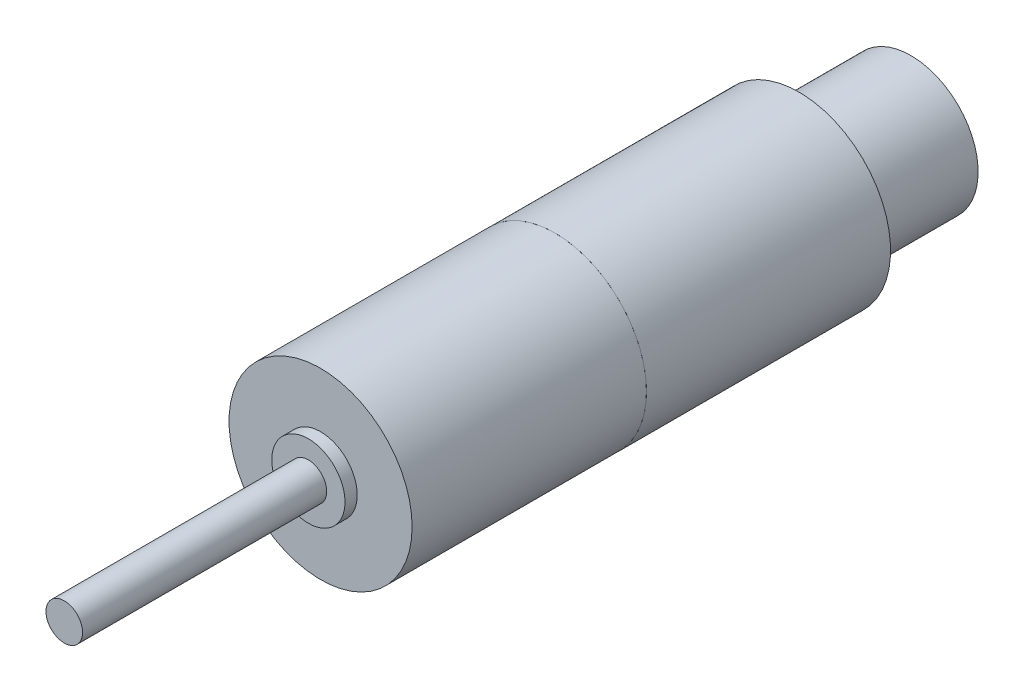
ISO-10303-21;
HEADER;
FILE_DESCRIPTION(('STEP AP214'),'2;1');
FILE_NAME('part.step','',(''),(''),'','','');
FILE_SCHEMA(('AUTOMOTIVE_DESIGN { 1 0 10303 214 1 1 1 1 }'));
ENDSEC;
DATA;
#1=APPLICATION_CONTEXT('core data for automotive mechanical design processes');
#2=APPLICATION_PROTOCOL_DEFINITION('international standard','automotive_design',2000,#1);
#3=PRODUCT_CONTEXT('',#1,'mechanical');
#4=PRODUCT('Part','Part','',(#3));
#5=PRODUCT_RELATED_PRODUCT_CATEGORY('part','',(#4));
#6=PRODUCT_DEFINITION_FORMATION('','',#4);
#7=PRODUCT_DEFINITION_CONTEXT('part definition',#1,'design');
#8=PRODUCT_DEFINITION('design','',#6,#7);
#9=PRODUCT_DEFINITION_SHAPE('','',#8);
#10=(LENGTH_UNIT() NAMED_UNIT(*) SI_UNIT(.MILLI.,.METRE.));
#11=(NAMED_UNIT(*) PLANE_ANGLE_UNIT() SI_UNIT($,.RADIAN.));
#12=(NAMED_UNIT(*) SI_UNIT($,.STERADIAN.) SOLID_ANGLE_UNIT());
#13=UNCERTAINTY_MEASURE_WITH_UNIT(LENGTH_MEASURE(1.E-05),#10,'distance_accuracy_value','');
#14=(GEOMETRIC_REPRESENTATION_CONTEXT(3) GLOBAL_UNCERTAINTY_ASSIGNED_CONTEXT((#13)) GLOBAL_UNIT_ASSIGNED_CONTEXT((#10,
#11,#12)) REPRESENTATION_CONTEXT('',''));
#15=CARTESIAN_POINT('',(0.,0.,0.));
#16=DIRECTION('',(0.,0.,1.));
#17=DIRECTION('',(1.,0.,0.));
#18=AXIS2_PLACEMENT_3D('',#15,#16,#17);
#19=CARTESIAN_POINT('',(0.,0.,80.4));
#20=DIRECTION('',(0.,0.,-1.));
#21=DIRECTION('',(-1.,0.,0.));
#22=AXIS2_PLACEMENT_3D('',#19,#20,#21);
#23=CYLINDRICAL_SURFACE('',#22,3.);
#24=CARTESIAN_POINT('',(0.,0.,80.4));
#25=DIRECTION('',(0.,0.,1.));
#26=DIRECTION('',(1.,0.,0.));
#27=AXIS2_PLACEMENT_3D('',#24,#25,#26);
#28=CIRCLE('',#27,3.);
#29=CARTESIAN_POINT('',(3.,0.,80.4));
#30=VERTEX_POINT('',#29);
#31=EDGE_CURVE('E11',#30,#30,#28,.T.);
#32=ORIENTED_EDGE('',*,*,#31,.F.);
#33=EDGE_LOOP('',(#32));
#34=FACE_BOUND('',#33,.T.);
#35=CARTESIAN_POINT('',(0.,0.,40.4));
#36=DIRECTION('',(0.,0.,1.));
#37=DIRECTION('',(1.,0.,0.));
#38=AXIS2_PLACEMENT_3D('',#35,#36,#37);
#39=CIRCLE('',#38,3.);
#40=CARTESIAN_POINT('',(3.,0.,40.4));
#41=VERTEX_POINT('',#40);
#42=EDGE_CURVE('E46',#41,#41,#39,.T.);
#43=ORIENTED_EDGE('',*,*,#42,.T.);
#44=EDGE_LOOP('',(#43));
#45=FACE_BOUND('',#44,.T.);
#46=ADVANCED_FACE('F43',(#34,#45),#23,.T.);
#47=CARTESIAN_POINT('',(0.,0.,80.4));
#48=DIRECTION('',(0.,0.,1.));
#49=DIRECTION('',(1.,0.,0.));
#50=AXIS2_PLACEMENT_3D('',#47,#48,#49);
#51=PLANE('',#50);
#52=ORIENTED_EDGE('',*,*,#31,.T.);
#53=EDGE_LOOP('',(#52));
#54=FACE_BOUND('',#53,.T.);
#55=ADVANCED_FACE('F58',(#54),#51,.T.);
#56=CARTESIAN_POINT('',(0.,0.,40.4));
#57=DIRECTION('',(0.,0.,1.));
#58=DIRECTION('',(1.,0.,0.));
#59=AXIS2_PLACEMENT_3D('',#56,#57,#58);
#60=PLANE('',#59);
#61=ORIENTED_EDGE('',*,*,#42,.F.);
#62=EDGE_LOOP('',(#61));
#63=FACE_BOUND('',#62,.T.);
#64=ADVANCED_FACE('F56',(#63),#60,.F.);
#65=CLOSED_SHELL('',(#46,#55,#64));
#66=MANIFOLD_SOLID_BREP('B2',#65);
#67=CARTESIAN_POINT('',(0.,0.,-58.35));
#68=DIRECTION('',(0.,0.,1.));
#69=DIRECTION('',(1.,0.,0.));
#70=AXIS2_PLACEMENT_3D('',#67,#68,#69);
#71=CYLINDRICAL_SURFACE('',#70,11.);
#72=CARTESIAN_POINT('',(0.,0.,-58.35));
#73=DIRECTION('',(0.,0.,-1.));
#74=DIRECTION('',(-1.,0.,0.));
#75=AXIS2_PLACEMENT_3D('',#72,#73,#74);
#76=CIRCLE('',#75,11.);
#77=CARTESIAN_POINT('',(-11.,0.,-58.35));
#78=VERTEX_POINT('',#77);
#79=EDGE_CURVE('E42',#78,#78,#76,.T.);
#80=ORIENTED_EDGE('',*,*,#79,.F.);
#81=EDGE_LOOP('',(#80));
#82=FACE_BOUND('',#81,.T.);
#83=CARTESIAN_POINT('',(0.,0.,-40.));
#84=DIRECTION('',(0.,0.,-1.));
#85=DIRECTION('',(-1.,0.,0.));
#86=AXIS2_PLACEMENT_3D('',#83,#84,#85);
#87=CIRCLE('',#86,11.);
#88=CARTESIAN_POINT('',(-11.,0.,-40.));
#89=VERTEX_POINT('',#88);
#90=EDGE_CURVE('E94',#89,#89,#87,.T.);
#91=ORIENTED_EDGE('',*,*,#90,.T.);
#92=EDGE_LOOP('',(#91));
#93=FACE_BOUND('',#92,.T.);
#94=ADVANCED_FACE('F91',(#82,#93),#71,.T.);
#95=CARTESIAN_POINT('',(0.,0.,-58.35));
#96=DIRECTION('',(0.,0.,-1.));
#97=DIRECTION('',(-1.,0.,0.));
#98=AXIS2_PLACEMENT_3D('',#95,#96,#97);
#99=PLANE('',#98);
#100=ORIENTED_EDGE('',*,*,#79,.T.);
#101=EDGE_LOOP('',(#100));
#102=FACE_BOUND('',#101,.T.);
#103=ADVANCED_FACE('F106',(#102),#99,.T.);
#104=CARTESIAN_POINT('',(0.,0.,-40.));
#105=DIRECTION('',(0.,0.,-1.));
#106=DIRECTION('',(-1.,0.,0.));
#107=AXIS2_PLACEMENT_3D('',#104,#105,#106);
#108=PLANE('',#107);
#109=ORIENTED_EDGE('',*,*,#90,.F.);
#110=EDGE_LOOP('',(#109));
#111=FACE_BOUND('',#110,.T.);
#112=ADVANCED_FACE('F104',(#111),#108,.F.);
#113=CLOSED_SHELL('',(#94,#103,#112));
#114=MANIFOLD_SOLID_BREP('B6',#113);
#115=CARTESIAN_POINT('',(0.,0.,-40.));
#116=DIRECTION('',(0.,0.,1.));
#117=DIRECTION('',(1.,0.,0.));
#118=AXIS2_PLACEMENT_3D('',#115,#116,#117);
#119=CYLINDRICAL_SURFACE('',#118,15.);
#120=CARTESIAN_POINT('',(0.,0.,-40.));
#121=DIRECTION('',(0.,0.,-1.));
#122=DIRECTION('',(-1.,0.,0.));
#123=AXIS2_PLACEMENT_3D('',#120,#121,#122);
#124=CIRCLE('',#123,15.);
#125=CARTESIAN_POINT('',(-15.,0.,-40.));
#126=VERTEX_POINT('',#125);
#127=EDGE_CURVE('E90',#126,#126,#124,.T.);
#128=ORIENTED_EDGE('',*,*,#127,.F.);
#129=EDGE_LOOP('',(#128));
#130=FACE_BOUND('',#129,.T.);
#131=CARTESIAN_POINT('',(0.,0.,0.));
#132=DIRECTION('',(0.,0.,-1.));
#133=DIRECTION('',(-1.,0.,0.));
#134=AXIS2_PLACEMENT_3D('',#131,#132,#133);
#135=CIRCLE('',#134,15.);
#136=CARTESIAN_POINT('',(-15.,0.,0.));
#137=VERTEX_POINT('',#136);
#138=EDGE_CURVE('E141',#137,#137,#135,.T.);
#139=ORIENTED_EDGE('',*,*,#138,.T.);
#140=EDGE_LOOP('',(#139));
#141=FACE_BOUND('',#140,.T.);
#142=ADVANCED_FACE('F138',(#130,#141),#119,.T.);
#143=CARTESIAN_POINT('',(0.,0.,-40.));
#144=DIRECTION('',(0.,0.,-1.));
#145=DIRECTION('',(-1.,0.,0.));
#146=AXIS2_PLACEMENT_3D('',#143,#144,#145);
#147=PLANE('',#146);
#148=ORIENTED_EDGE('',*,*,#127,.T.);
#149=EDGE_LOOP('',(#148));
#150=FACE_BOUND('',#149,.T.);
#151=ADVANCED_FACE('F153',(#150),#147,.T.);
#152=CARTESIAN_POINT('',(0.,0.,0.));
#153=DIRECTION('',(0.,0.,-1.));
#154=DIRECTION('',(-1.,0.,0.));
#155=AXIS2_PLACEMENT_3D('',#152,#153,#154);
#156=PLANE('',#155);
#157=ORIENTED_EDGE('',*,*,#138,.F.);
#158=EDGE_LOOP('',(#157));
#159=FACE_BOUND('',#158,.T.);
#160=ADVANCED_FACE('F151',(#159),#156,.F.);
#161=CLOSED_SHELL('',(#142,#151,#160));
#162=MANIFOLD_SOLID_BREP('B37',#161);
#163=CARTESIAN_POINT('',(0.,0.,38.4));
#164=DIRECTION('',(0.,0.,-1.));
#165=DIRECTION('',(-1.,0.,0.));
#166=AXIS2_PLACEMENT_3D('',#163,#164,#165);
#167=CYLINDRICAL_SURFACE('',#166,15.);
#168=CARTESIAN_POINT('',(0.,0.,38.4));
#169=DIRECTION('',(0.,0.,1.));
#170=DIRECTION('',(1.,0.,0.));
#171=AXIS2_PLACEMENT_3D('',#168,#169,#170);
#172=CIRCLE('',#171,15.);
#173=CARTESIAN_POINT('',(15.,0.,38.4));
#174=VERTEX_POINT('',#173);
#175=EDGE_CURVE('E185',#174,#174,#172,.T.);
#176=ORIENTED_EDGE('',*,*,#175,.F.);
#177=EDGE_LOOP('',(#176));
#178=FACE_BOUND('',#177,.T.);
#179=CARTESIAN_POINT('',(0.,0.,0.));
#180=DIRECTION('',(0.,0.,1.));
#181=DIRECTION('',(1.,0.,0.));
#182=AXIS2_PLACEMENT_3D('',#179,#180,#181);
#183=CIRCLE('',#182,15.);
#184=CARTESIAN_POINT('',(15.,0.,0.));
#185=VERTEX_POINT('',#184);
#186=EDGE_CURVE('E181',#185,#185,#183,.T.);
#187=ORIENTED_EDGE('',*,*,#186,.T.);
#188=EDGE_LOOP('',(#187));
#189=FACE_BOUND('',#188,.T.);
#190=ADVANCED_FACE('F178',(#178,#189),#167,.T.);
#191=CARTESIAN_POINT('',(0.,0.,38.4));
#192=DIRECTION('',(0.,0.,1.));
#193=DIRECTION('',(1.,0.,0.));
#194=AXIS2_PLACEMENT_3D('',#191,#192,#193);
#195=PLANE('',#194);
#196=CARTESIAN_POINT('',(0.,0.,38.4));
#197=DIRECTION('',(0.,0.,1.));
#198=DIRECTION('',(1.,0.,0.));
#199=AXIS2_PLACEMENT_3D('',#196,#197,#198);
#200=CIRCLE('',#199,6.);
#201=CARTESIAN_POINT('',(6.,0.,38.4));
#202=VERTEX_POINT('',#201);
#203=EDGE_CURVE('E137',#202,#202,#200,.T.);
#204=ORIENTED_EDGE('',*,*,#203,.F.);
#205=EDGE_LOOP('',(#204));
#206=FACE_BOUND('',#205,.T.);
#207=ORIENTED_EDGE('',*,*,#175,.T.);
#208=EDGE_LOOP('',(#207));
#209=FACE_BOUND('',#208,.T.);
#210=ADVANCED_FACE('F202',(#206,#209),#195,.T.);
#211=CARTESIAN_POINT('',(0.,0.,0.));
#212=DIRECTION('',(0.,0.,1.));
#213=DIRECTION('',(1.,0.,0.));
#214=AXIS2_PLACEMENT_3D('',#211,#212,#213);
#215=PLANE('',#214);
#216=ORIENTED_EDGE('',*,*,#186,.F.);
#217=EDGE_LOOP('',(#216));
#218=FACE_BOUND('',#217,.T.);
#219=ADVANCED_FACE('F199',(#218),#215,.F.);
#220=CARTESIAN_POINT('',(0.,0.,40.4));
#221=DIRECTION('',(0.,0.,-1.));
#222=DIRECTION('',(-1.,0.,0.));
#223=AXIS2_PLACEMENT_3D('',#220,#221,#222);
#224=CYLINDRICAL_SURFACE('',#223,6.);
#225=CARTESIAN_POINT('',(0.,0.,40.4));
#226=DIRECTION('',(0.,0.,1.));
#227=DIRECTION('',(1.,0.,0.));
#228=AXIS2_PLACEMENT_3D('',#225,#226,#227);
#229=CIRCLE('',#228,6.);
#230=CARTESIAN_POINT('',(6.,0.,40.4));
#231=VERTEX_POINT('',#230);
#232=EDGE_CURVE('E191',#231,#231,#229,.T.);
#233=ORIENTED_EDGE('',*,*,#232,.F.);
#234=EDGE_LOOP('',(#233));
#235=FACE_BOUND('',#234,.T.);
#236=ORIENTED_EDGE('',*,*,#203,.T.);
#237=EDGE_LOOP('',(#236));
#238=FACE_BOUND('',#237,.T.);
#239=ADVANCED_FACE('F201',(#235,#238),#224,.T.);
#240=CARTESIAN_POINT('',(0.,0.,40.4));
#241=DIRECTION('',(0.,0.,1.));
#242=DIRECTION('',(1.,0.,0.));
#243=AXIS2_PLACEMENT_3D('',#240,#241,#242);
#244=PLANE('',#243);
#245=ORIENTED_EDGE('',*,*,#232,.T.);
#246=EDGE_LOOP('',(#245));
#247=FACE_BOUND('',#246,.T.);
#248=ADVANCED_FACE('F207',(#247),#244,.T.);
#249=CLOSED_SHELL('',(#190,#210,#219,#239,#248));
#250=MANIFOLD_SOLID_BREP('B85',#249);
#251=ADVANCED_BREP_SHAPE_REPRESENTATION('',(#18,#66,#114,#162,#250),#14);
#252=SHAPE_DEFINITION_REPRESENTATION(#9,#251);
ENDSEC;
END-ISO-10303-21;
